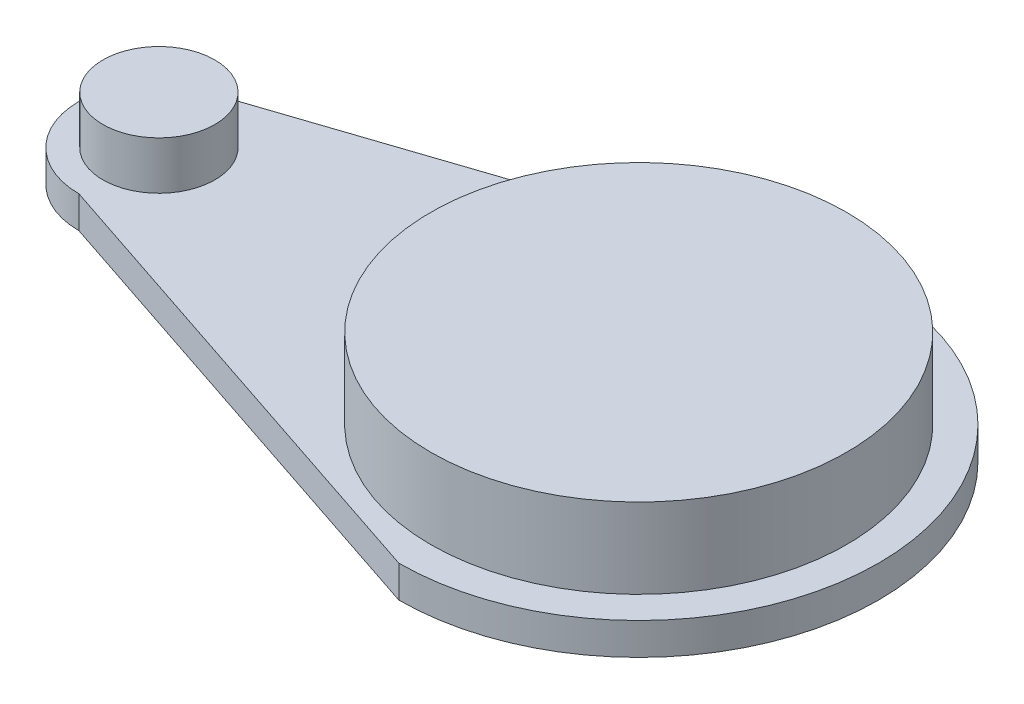
ISO-10303-21;
HEADER;
FILE_DESCRIPTION(('STEP AP214'),'2;1');
FILE_NAME('part.step','',(''),(''),'','','');
FILE_SCHEMA(('AUTOMOTIVE_DESIGN { 1 0 10303 214 1 1 1 1 }'));
ENDSEC;
DATA;
#1=APPLICATION_CONTEXT('core data for automotive mechanical design processes');
#2=APPLICATION_PROTOCOL_DEFINITION('international standard','automotive_design',2000,#1);
#3=PRODUCT_CONTEXT('',#1,'mechanical');
#4=PRODUCT('Part','Part','',(#3));
#5=PRODUCT_RELATED_PRODUCT_CATEGORY('part','',(#4));
#6=PRODUCT_DEFINITION_FORMATION('','',#4);
#7=PRODUCT_DEFINITION_CONTEXT('part definition',#1,'design');
#8=PRODUCT_DEFINITION('design','',#6,#7);
#9=PRODUCT_DEFINITION_SHAPE('','',#8);
#10=(LENGTH_UNIT() NAMED_UNIT(*) SI_UNIT(.MILLI.,.METRE.));
#11=(NAMED_UNIT(*) PLANE_ANGLE_UNIT() SI_UNIT($,.RADIAN.));
#12=(NAMED_UNIT(*) SI_UNIT($,.STERADIAN.) SOLID_ANGLE_UNIT());
#13=UNCERTAINTY_MEASURE_WITH_UNIT(LENGTH_MEASURE(1.E-05),#10,'distance_accuracy_value','');
#14=(GEOMETRIC_REPRESENTATION_CONTEXT(3) GLOBAL_UNCERTAINTY_ASSIGNED_CONTEXT((#13)) GLOBAL_UNIT_ASSIGNED_CONTEXT((#10,
#11,#12)) REPRESENTATION_CONTEXT('',''));
#15=CARTESIAN_POINT('',(0.,0.,0.));
#16=DIRECTION('',(0.,0.,1.));
#17=DIRECTION('',(1.,0.,0.));
#18=AXIS2_PLACEMENT_3D('',#15,#16,#17);
#19=CARTESIAN_POINT('',(38.1,2.54,-19.05));
#20=DIRECTION('',(0.,-1.,0.));
#21=DIRECTION('',(0.,0.,-1.));
#22=AXIS2_PLACEMENT_3D('',#19,#20,#21);
#23=PLANE('',#22);
#24=CARTESIAN_POINT('',(38.1,2.54,-19.05));
#25=DIRECTION('',(0.,-1.,0.));
#26=DIRECTION('',(0.,0.,-1.));
#27=AXIS2_PLACEMENT_3D('',#24,#25,#26);
#28=CIRCLE('',#27,16.51);
#29=CARTESIAN_POINT('',(38.1,2.54,-35.56));
#30=VERTEX_POINT('',#29);
#31=EDGE_CURVE('E41',#30,#30,#28,.F.);
#32=ORIENTED_EDGE('',*,*,#31,.F.);
#33=EDGE_LOOP('',(#32));
#34=FACE_BOUND('',#33,.T.);
#35=CARTESIAN_POINT('',(38.1,2.54,-19.05));
#36=DIRECTION('',(0.,1.,0.));
#37=DIRECTION('',(0.,0.,-1.));
#38=AXIS2_PLACEMENT_3D('',#35,#36,#37);
#39=CIRCLE('',#38,19.05);
#40=CARTESIAN_POINT('',(38.1,2.54,0.));
#41=VERTEX_POINT('',#40);
#42=CARTESIAN_POINT('',(38.1,2.54,-38.1));
#43=VERTEX_POINT('',#42);
#44=EDGE_CURVE('E85',#41,#43,#39,.T.);
#45=ORIENTED_EDGE('',*,*,#44,.T.);
#46=DIRECTION('',(-0.948683298050514,0.,0.316227766016838));
#47=VECTOR('',#46,1.);
#48=CARTESIAN_POINT('',(0.,2.54,-25.4));
#49=LINE('',#48,#47);
#50=CARTESIAN_POINT('',(0.,2.54,-25.4));
#51=VERTEX_POINT('',#50);
#52=EDGE_CURVE('E80',#43,#51,#49,.T.);
#53=ORIENTED_EDGE('',*,*,#52,.T.);
#54=CARTESIAN_POINT('',(0.,2.54,-19.05));
#55=DIRECTION('',(0.,1.,0.));
#56=DIRECTION('',(0.,0.,1.));
#57=AXIS2_PLACEMENT_3D('',#54,#55,#56);
#58=CIRCLE('',#57,6.35);
#59=CARTESIAN_POINT('',(0.,2.54,-12.7));
#60=VERTEX_POINT('',#59);
#61=EDGE_CURVE('E83',#51,#60,#58,.T.);
#62=ORIENTED_EDGE('',*,*,#61,.T.);
#63=DIRECTION('',(0.948683298050514,0.,0.316227766016838));
#64=VECTOR('',#63,1.);
#65=CARTESIAN_POINT('',(0.,2.54,-12.7));
#66=LINE('',#65,#64);
#67=EDGE_CURVE('E49',#60,#41,#66,.T.);
#68=ORIENTED_EDGE('',*,*,#67,.T.);
#69=EDGE_LOOP('',(#45,#53,#62,#68));
#70=FACE_BOUND('',#69,.T.);
#71=CARTESIAN_POINT('',(0.,2.54,-19.05));
#72=DIRECTION('',(0.,-1.,0.));
#73=DIRECTION('',(0.,0.,-1.));
#74=AXIS2_PLACEMENT_3D('',#71,#72,#73);
#75=CIRCLE('',#74,4.445);
#76=CARTESIAN_POINT('',(0.,2.54,-23.495));
#77=VERTEX_POINT('',#76);
#78=EDGE_CURVE('E11',#77,#77,#75,.F.);
#79=ORIENTED_EDGE('',*,*,#78,.F.);
#80=EDGE_LOOP('',(#79));
#81=FACE_BOUND('',#80,.T.);
#82=ADVANCED_FACE('F32',(#34,#70,#81),#23,.F.);
#83=CARTESIAN_POINT('',(38.1,2.54,-19.05));
#84=DIRECTION('',(0.,-1.,0.));
#85=DIRECTION('',(0.,0.,-1.));
#86=AXIS2_PLACEMENT_3D('',#83,#84,#85);
#87=CYLINDRICAL_SURFACE('',#86,19.05);
#88=CARTESIAN_POINT('',(38.1,0.,-19.05));
#89=DIRECTION('',(0.,1.,0.));
#90=DIRECTION('',(0.,0.,-1.));
#91=AXIS2_PLACEMENT_3D('',#88,#89,#90);
#92=CIRCLE('',#91,19.05);
#93=CARTESIAN_POINT('',(38.1,0.,0.));
#94=VERTEX_POINT('',#93);
#95=CARTESIAN_POINT('',(38.1,0.,-38.1));
#96=VERTEX_POINT('',#95);
#97=EDGE_CURVE('E100',#94,#96,#92,.T.);
#98=ORIENTED_EDGE('',*,*,#97,.T.);
#99=DIRECTION('',(0.,-1.,0.));
#100=VECTOR('',#99,1.);
#101=CARTESIAN_POINT('',(38.1,2.54,-38.1));
#102=LINE('',#101,#100);
#103=EDGE_CURVE('E91',#43,#96,#102,.T.);
#104=ORIENTED_EDGE('',*,*,#103,.F.);
#105=ORIENTED_EDGE('',*,*,#44,.F.);
#106=DIRECTION('',(0.,-1.,0.));
#107=VECTOR('',#106,1.);
#108=CARTESIAN_POINT('',(38.1,2.54,0.));
#109=LINE('',#108,#107);
#110=EDGE_CURVE('E96',#41,#94,#109,.T.);
#111=ORIENTED_EDGE('',*,*,#110,.T.);
#112=EDGE_LOOP('',(#98,#104,#105,#111));
#113=FACE_BOUND('',#112,.T.);
#114=ADVANCED_FACE('F34',(#113),#87,.T.);
#115=CARTESIAN_POINT('',(0.,2.54,-25.4));
#116=DIRECTION('',(0.316227766016838,0.,0.948683298050514));
#117=DIRECTION('',(0.948683298050514,0.,-0.316227766016838));
#118=AXIS2_PLACEMENT_3D('',#115,#116,#117);
#119=PLANE('',#118);
#120=DIRECTION('',(-0.948683298050514,0.,0.316227766016838));
#121=VECTOR('',#120,1.);
#122=CARTESIAN_POINT('',(0.,0.,-25.4));
#123=LINE('',#122,#121);
#124=CARTESIAN_POINT('',(0.,0.,-25.4));
#125=VERTEX_POINT('',#124);
#126=EDGE_CURVE('E90',#96,#125,#123,.T.);
#127=ORIENTED_EDGE('',*,*,#126,.T.);
#128=DIRECTION('',(0.,-1.,0.));
#129=VECTOR('',#128,1.);
#130=CARTESIAN_POINT('',(0.,2.54,-25.4));
#131=LINE('',#130,#129);
#132=EDGE_CURVE('E88',#51,#125,#131,.T.);
#133=ORIENTED_EDGE('',*,*,#132,.F.);
#134=ORIENTED_EDGE('',*,*,#52,.F.);
#135=ORIENTED_EDGE('',*,*,#103,.T.);
#136=EDGE_LOOP('',(#127,#133,#134,#135));
#137=FACE_BOUND('',#136,.T.);
#138=ADVANCED_FACE('F89',(#137),#119,.F.);
#139=CARTESIAN_POINT('',(0.,2.54,-19.05));
#140=DIRECTION('',(0.,-1.,0.));
#141=DIRECTION('',(0.,0.,-1.));
#142=AXIS2_PLACEMENT_3D('',#139,#140,#141);
#143=CYLINDRICAL_SURFACE('',#142,6.35);
#144=CARTESIAN_POINT('',(0.,0.,-19.05));
#145=DIRECTION('',(0.,1.,0.));
#146=DIRECTION('',(0.,0.,1.));
#147=AXIS2_PLACEMENT_3D('',#144,#145,#146);
#148=CIRCLE('',#147,6.35);
#149=CARTESIAN_POINT('',(0.,0.,-12.7));
#150=VERTEX_POINT('',#149);
#151=EDGE_CURVE('E66',#125,#150,#148,.T.);
#152=ORIENTED_EDGE('',*,*,#151,.T.);
#153=DIRECTION('',(0.,-1.,0.));
#154=VECTOR('',#153,1.);
#155=CARTESIAN_POINT('',(0.,2.54,-12.7));
#156=LINE('',#155,#154);
#157=EDGE_CURVE('E92',#60,#150,#156,.T.);
#158=ORIENTED_EDGE('',*,*,#157,.F.);
#159=ORIENTED_EDGE('',*,*,#61,.F.);
#160=ORIENTED_EDGE('',*,*,#132,.T.);
#161=EDGE_LOOP('',(#152,#158,#159,#160));
#162=FACE_BOUND('',#161,.T.);
#163=ADVANCED_FACE('F94',(#162),#143,.T.);
#164=CARTESIAN_POINT('',(0.,2.54,-12.7));
#165=DIRECTION('',(0.316227766016838,0.,-0.948683298050514));
#166=DIRECTION('',(-0.948683298050514,0.,-0.316227766016838));
#167=AXIS2_PLACEMENT_3D('',#164,#165,#166);
#168=PLANE('',#167);
#169=DIRECTION('',(0.948683298050514,0.,0.316227766016838));
#170=VECTOR('',#169,1.);
#171=CARTESIAN_POINT('',(0.,0.,-12.7));
#172=LINE('',#171,#170);
#173=EDGE_CURVE('E72',#150,#94,#172,.T.);
#174=ORIENTED_EDGE('',*,*,#173,.T.);
#175=ORIENTED_EDGE('',*,*,#110,.F.);
#176=ORIENTED_EDGE('',*,*,#67,.F.);
#177=ORIENTED_EDGE('',*,*,#157,.T.);
#178=EDGE_LOOP('',(#174,#175,#176,#177));
#179=FACE_BOUND('',#178,.T.);
#180=ADVANCED_FACE('F126',(#179),#168,.F.);
#181=CARTESIAN_POINT('',(38.1,0.,-19.05));
#182=DIRECTION('',(0.,-1.,0.));
#183=DIRECTION('',(0.,0.,-1.));
#184=AXIS2_PLACEMENT_3D('',#181,#182,#183);
#185=PLANE('',#184);
#186=ORIENTED_EDGE('',*,*,#97,.F.);
#187=ORIENTED_EDGE('',*,*,#173,.F.);
#188=ORIENTED_EDGE('',*,*,#151,.F.);
#189=ORIENTED_EDGE('',*,*,#126,.F.);
#190=EDGE_LOOP('',(#186,#187,#188,#189));
#191=FACE_BOUND('',#190,.T.);
#192=ADVANCED_FACE('F123',(#191),#185,.T.);
#193=CARTESIAN_POINT('',(38.1,8.89,-19.05));
#194=DIRECTION('',(0.,-1.,0.));
#195=DIRECTION('',(0.,0.,-1.));
#196=AXIS2_PLACEMENT_3D('',#193,#194,#195);
#197=CYLINDRICAL_SURFACE('',#196,16.51);
#198=CARTESIAN_POINT('',(38.1,8.89,-19.05));
#199=DIRECTION('',(0.,1.,0.));
#200=DIRECTION('',(0.,0.,1.));
#201=AXIS2_PLACEMENT_3D('',#198,#199,#200);
#202=CIRCLE('',#201,16.51);
#203=CARTESIAN_POINT('',(38.1,8.89,-2.54000000000001));
#204=VERTEX_POINT('',#203);
#205=EDGE_CURVE('E103',#204,#204,#202,.T.);
#206=ORIENTED_EDGE('',*,*,#205,.F.);
#207=EDGE_LOOP('',(#206));
#208=FACE_BOUND('',#207,.T.);
#209=ORIENTED_EDGE('',*,*,#31,.T.);
#210=EDGE_LOOP('',(#209));
#211=FACE_BOUND('',#210,.T.);
#212=ADVANCED_FACE('F112',(#208,#211),#197,.T.);
#213=CARTESIAN_POINT('',(38.1,8.89,-19.05));
#214=DIRECTION('',(0.,1.,0.));
#215=DIRECTION('',(0.,0.,1.));
#216=AXIS2_PLACEMENT_3D('',#213,#214,#215);
#217=PLANE('',#216);
#218=ORIENTED_EDGE('',*,*,#205,.T.);
#219=EDGE_LOOP('',(#218));
#220=FACE_BOUND('',#219,.T.);
#221=ADVANCED_FACE('F154',(#220),#217,.T.);
#222=CARTESIAN_POINT('',(0.,6.35,-19.05));
#223=DIRECTION('',(0.,-1.,0.));
#224=DIRECTION('',(0.,0.,-1.));
#225=AXIS2_PLACEMENT_3D('',#222,#223,#224);
#226=CYLINDRICAL_SURFACE('',#225,4.445);
#227=CARTESIAN_POINT('',(0.,6.35,-19.05));
#228=DIRECTION('',(0.,1.,0.));
#229=DIRECTION('',(0.,0.,1.));
#230=AXIS2_PLACEMENT_3D('',#227,#228,#229);
#231=CIRCLE('',#230,4.445);
#232=CARTESIAN_POINT('',(0.,6.35,-23.495));
#233=VERTEX_POINT('',#232);
#234=EDGE_CURVE('E205',#233,#233,#231,.T.);
#235=CARTESIAN_POINT('',(0.,6.35,-23.495));
#236=CARTESIAN_POINT('',(0.,6.3103125,-23.495));
#237=CARTESIAN_POINT('',(0.,6.270625,-23.495));
#238=CARTESIAN_POINT('',(0.,6.19125,-23.495));
#239=CARTESIAN_POINT('',(0.,6.1515625,-23.495));
#240=CARTESIAN_POINT('',(0.,6.0721875,-23.495));
#241=CARTESIAN_POINT('',(0.,6.0325,-23.495));
#242=CARTESIAN_POINT('',(0.,5.953125,-23.495));
#243=CARTESIAN_POINT('',(0.,5.9134375,-23.495));
#244=CARTESIAN_POINT('',(0.,5.8340625,-23.495));
#245=CARTESIAN_POINT('',(0.,5.794375,-23.495));
#246=CARTESIAN_POINT('',(0.,5.715,-23.495));
#247=CARTESIAN_POINT('',(0.,5.6753125,-23.495));
#248=CARTESIAN_POINT('',(0.,5.5959375,-23.495));
#249=CARTESIAN_POINT('',(0.,5.55625,-23.495));
#250=CARTESIAN_POINT('',(0.,5.476875,-23.495));
#251=CARTESIAN_POINT('',(0.,5.4371875,-23.495));
#252=CARTESIAN_POINT('',(0.,5.3578125,-23.495));
#253=CARTESIAN_POINT('',(0.,5.318125,-23.495));
#254=CARTESIAN_POINT('',(0.,5.23875,-23.495));
#255=CARTESIAN_POINT('',(0.,5.1990625,-23.495));
#256=CARTESIAN_POINT('',(0.,5.1196875,-23.495));
#257=CARTESIAN_POINT('',(0.,5.08,-23.495));
#258=CARTESIAN_POINT('',(0.,5.000625,-23.495));
#259=CARTESIAN_POINT('',(0.,4.9609375,-23.495));
#260=CARTESIAN_POINT('',(0.,4.8815625,-23.495));
#261=CARTESIAN_POINT('',(0.,4.841875,-23.495));
#262=CARTESIAN_POINT('',(0.,4.7625,-23.495));
#263=CARTESIAN_POINT('',(0.,4.7228125,-23.495));
#264=CARTESIAN_POINT('',(0.,4.6434375,-23.495));
#265=CARTESIAN_POINT('',(0.,4.60375,-23.495));
#266=CARTESIAN_POINT('',(0.,4.524375,-23.495));
#267=CARTESIAN_POINT('',(0.,4.4846875,-23.495));
#268=CARTESIAN_POINT('',(0.,4.4053125,-23.495));
#269=CARTESIAN_POINT('',(0.,4.365625,-23.495));
#270=CARTESIAN_POINT('',(0.,4.28625,-23.495));
#271=CARTESIAN_POINT('',(0.,4.2465625,-23.495));
#272=CARTESIAN_POINT('',(0.,4.1671875,-23.495));
#273=CARTESIAN_POINT('',(0.,4.1275,-23.495));
#274=CARTESIAN_POINT('',(0.,4.048125,-23.495));
#275=CARTESIAN_POINT('',(0.,4.0084375,-23.495));
#276=CARTESIAN_POINT('',(0.,3.9290625,-23.495));
#277=CARTESIAN_POINT('',(0.,3.889375,-23.495));
#278=CARTESIAN_POINT('',(0.,3.81,-23.495));
#279=CARTESIAN_POINT('',(0.,3.7703125,-23.495));
#280=CARTESIAN_POINT('',(0.,3.6909375,-23.495));
#281=CARTESIAN_POINT('',(0.,3.65125,-23.495));
#282=CARTESIAN_POINT('',(0.,3.571875,-23.495));
#283=CARTESIAN_POINT('',(0.,3.5321875,-23.495));
#284=CARTESIAN_POINT('',(0.,3.4528125,-23.495));
#285=CARTESIAN_POINT('',(0.,3.413125,-23.495));
#286=CARTESIAN_POINT('',(0.,3.33375,-23.495));
#287=CARTESIAN_POINT('',(0.,3.2940625,-23.495));
#288=CARTESIAN_POINT('',(0.,3.2146875,-23.495));
#289=CARTESIAN_POINT('',(0.,3.175,-23.495));
#290=CARTESIAN_POINT('',(0.,3.095625,-23.495));
#291=CARTESIAN_POINT('',(0.,3.0559375,-23.495));
#292=CARTESIAN_POINT('',(0.,2.9765625,-23.495));
#293=CARTESIAN_POINT('',(0.,2.936875,-23.495));
#294=CARTESIAN_POINT('',(0.,2.8575,-23.495));
#295=CARTESIAN_POINT('',(0.,2.8178125,-23.495));
#296=CARTESIAN_POINT('',(0.,2.7384375,-23.495));
#297=CARTESIAN_POINT('',(0.,2.69875,-23.495));
#298=CARTESIAN_POINT('',(0.,2.619375,-23.495));
#299=CARTESIAN_POINT('',(0.,2.5796875,-23.495));
#300=CARTESIAN_POINT('',(0.,2.54,-23.495));
#301=B_SPLINE_CURVE_WITH_KNOTS('',3,(#235,#236,#237,#238,#239,#240,#241,#242,#243,#244,#245,
#246,#247,#248,#249,#250,#251,#252,#253,#254,#255,#256,#257,#258,#259,#260,#261,#262,#263,#264,
#265,#266,#267,#268,#269,#270,#271,#272,#273,#274,#275,#276,#277,#278,#279,#280,#281,#282,#283,
#284,#285,#286,#287,#288,#289,#290,#291,#292,#293,#294,#295,#296,#297,#298,#299,#300),
.UNSPECIFIED.,.F.,.F.,(4,2,2,2,2,2,2,2,2,2,2,2,2,2,2,2,2,2,2,2,2,2,2,2,2,2,2,2,2,2,2,2,4),(0.,
0.1190625,0.238125,0.357187500000001,0.47625,0.5953125,0.714375000000001,0.8334375,0.9525,
1.0715625,1.190625,1.3096875,1.42875,1.5478125,1.666875,1.7859375,1.905,2.0240625,2.143125,
2.2621875,2.38125,2.5003125,2.619375,2.7384375,2.8575,2.9765625,3.095625,3.2146875,3.33375,
3.4528125,3.571875,3.6909375,3.81),.UNSPECIFIED.);
#302=EDGE_CURVE('BSEAM161',#233,#77,#301,.T.);
#303=ORIENTED_EDGE('',*,*,#234,.F.);
#304=ORIENTED_EDGE('',*,*,#78,.T.);
#305=ORIENTED_EDGE('',*,*,#302,.T.);
#306=ORIENTED_EDGE('',*,*,#302,.F.);
#307=EDGE_LOOP('',(#303,#305,#304,#306));
#308=FACE_BOUND('',#307,.T.);
#309=ADVANCED_FACE('F161',(#308),#226,.T.);
#310=CARTESIAN_POINT('',(0.,6.35,-19.05));
#311=DIRECTION('',(0.,1.,0.));
#312=DIRECTION('',(0.,0.,1.));
#313=AXIS2_PLACEMENT_3D('',#310,#311,#312);
#314=PLANE('',#313);
#315=ORIENTED_EDGE('',*,*,#234,.T.);
#316=EDGE_LOOP('',(#315));
#317=FACE_BOUND('',#316,.T.);
#318=ADVANCED_FACE('F168',(#317),#314,.T.);
#319=CLOSED_SHELL('',(#82,#114,#138,#163,#180,#192,#212,#221,#309,#318));
#320=MANIFOLD_SOLID_BREP('B2',#319);
#321=ADVANCED_BREP_SHAPE_REPRESENTATION('',(#18,#320),#14);
#322=SHAPE_DEFINITION_REPRESENTATION(#9,#321);
ENDSEC;
END-ISO-10303-21;
